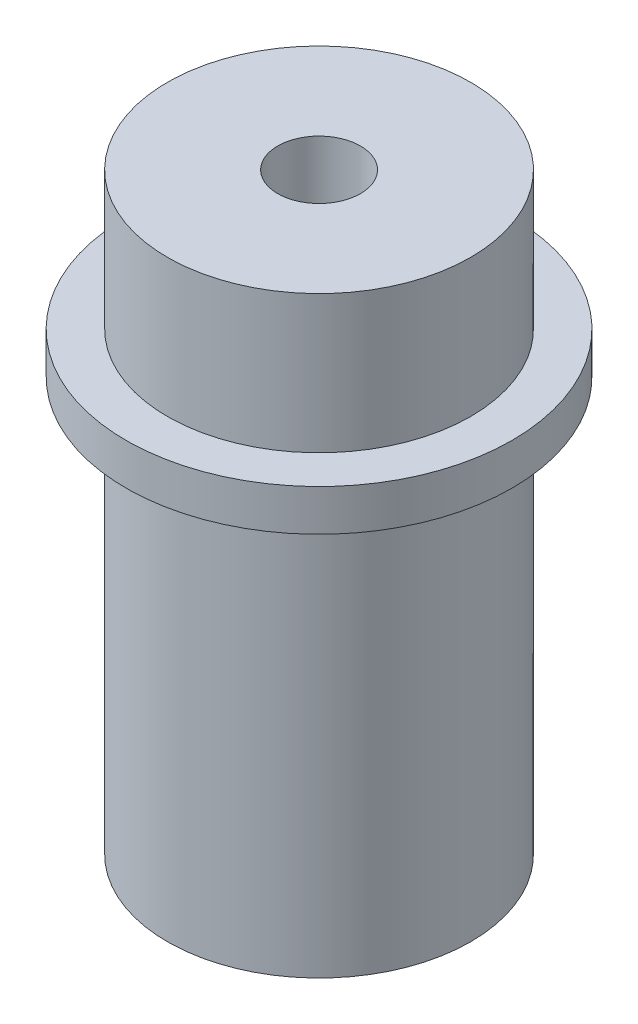
ISO-10303-21;
HEADER;
FILE_DESCRIPTION(('STEP AP214'),'2;1');
FILE_NAME('part.step','',(''),(''),'','','');
FILE_SCHEMA(('AUTOMOTIVE_DESIGN { 1 0 10303 214 1 1 1 1 }'));
ENDSEC;
DATA;
#1=APPLICATION_CONTEXT('core data for automotive mechanical design processes');
#2=APPLICATION_PROTOCOL_DEFINITION('international standard','automotive_design',2000,#1);
#3=PRODUCT_CONTEXT('',#1,'mechanical');
#4=PRODUCT('Part','Part','',(#3));
#5=PRODUCT_RELATED_PRODUCT_CATEGORY('part','',(#4));
#6=PRODUCT_DEFINITION_FORMATION('','',#4);
#7=PRODUCT_DEFINITION_CONTEXT('part definition',#1,'design');
#8=PRODUCT_DEFINITION('design','',#6,#7);
#9=PRODUCT_DEFINITION_SHAPE('','',#8);
#10=(LENGTH_UNIT() NAMED_UNIT(*) SI_UNIT(.MILLI.,.METRE.));
#11=(NAMED_UNIT(*) PLANE_ANGLE_UNIT() SI_UNIT($,.RADIAN.));
#12=(NAMED_UNIT(*) SI_UNIT($,.STERADIAN.) SOLID_ANGLE_UNIT());
#13=UNCERTAINTY_MEASURE_WITH_UNIT(LENGTH_MEASURE(1.E-05),#10,'distance_accuracy_value','');
#14=(GEOMETRIC_REPRESENTATION_CONTEXT(3) GLOBAL_UNCERTAINTY_ASSIGNED_CONTEXT((#13)) GLOBAL_UNIT_ASSIGNED_CONTEXT((#10,
#11,#12)) REPRESENTATION_CONTEXT('',''));
#15=CARTESIAN_POINT('',(0.,0.,0.));
#16=DIRECTION('',(0.,0.,1.));
#17=DIRECTION('',(1.,0.,0.));
#18=AXIS2_PLACEMENT_3D('',#15,#16,#17);
#19=CARTESIAN_POINT('',(0.,0.,0.));
#20=DIRECTION('',(0.,-1.,0.));
#21=DIRECTION('',(1.,0.,0.));
#22=AXIS2_PLACEMENT_3D('',#19,#20,#21);
#23=CYLINDRICAL_SURFACE('',#22,3.);
#24=CARTESIAN_POINT('',(0.,0.,0.));
#25=DIRECTION('',(0.,-1.,0.));
#26=DIRECTION('',(1.,0.,0.));
#27=AXIS2_PLACEMENT_3D('',#24,#25,#26);
#28=CIRCLE('',#27,3.);
#29=CARTESIAN_POINT('',(3.,0.,0.));
#30=VERTEX_POINT('',#29);
#31=EDGE_CURVE('E63',#30,#30,#28,.T.);
#32=ORIENTED_EDGE('',*,*,#31,.T.);
#33=EDGE_LOOP('',(#32));
#34=FACE_BOUND('',#33,.T.);
#35=CARTESIAN_POINT('',(0.,43.,0.));
#36=DIRECTION('',(0.,-1.,0.));
#37=DIRECTION('',(1.,0.,0.));
#38=AXIS2_PLACEMENT_3D('',#35,#36,#37);
#39=CIRCLE('',#38,3.);
#40=CARTESIAN_POINT('',(3.,43.,0.));
#41=VERTEX_POINT('',#40);
#42=EDGE_CURVE('E10',#41,#41,#39,.T.);
#43=ORIENTED_EDGE('',*,*,#42,.F.);
#44=EDGE_LOOP('',(#43));
#45=FACE_BOUND('',#44,.T.);
#46=ADVANCED_FACE('F35',(#34,#45),#23,.F.);
#47=CARTESIAN_POINT('',(0.,43.,0.));
#48=DIRECTION('',(0.,-1.,0.));
#49=DIRECTION('',(1.,0.,0.));
#50=AXIS2_PLACEMENT_3D('',#47,#48,#49);
#51=PLANE('',#50);
#52=CARTESIAN_POINT('',(0.,43.,0.));
#53=DIRECTION('',(0.,-1.,0.));
#54=DIRECTION('',(1.,0.,0.));
#55=AXIS2_PLACEMENT_3D('',#52,#53,#54);
#56=CIRCLE('',#55,11.);
#57=CARTESIAN_POINT('',(11.,43.,0.));
#58=VERTEX_POINT('',#57);
#59=EDGE_CURVE('E41',#58,#58,#56,.T.);
#60=ORIENTED_EDGE('',*,*,#59,.F.);
#61=EDGE_LOOP('',(#60));
#62=FACE_BOUND('',#61,.T.);
#63=ORIENTED_EDGE('',*,*,#42,.T.);
#64=EDGE_LOOP('',(#63));
#65=FACE_BOUND('',#64,.T.);
#66=ADVANCED_FACE('F81',(#62,#65),#51,.F.);
#67=CARTESIAN_POINT('',(0.,0.,0.));
#68=DIRECTION('',(0.,-1.,0.));
#69=DIRECTION('',(1.,0.,0.));
#70=AXIS2_PLACEMENT_3D('',#67,#68,#69);
#71=CYLINDRICAL_SURFACE('',#70,11.);
#72=ORIENTED_EDGE('',*,*,#59,.T.);
#73=EDGE_LOOP('',(#72));
#74=FACE_BOUND('',#73,.T.);
#75=CARTESIAN_POINT('',(0.,33.,0.));
#76=DIRECTION('',(0.,-1.,0.));
#77=DIRECTION('',(1.,0.,0.));
#78=AXIS2_PLACEMENT_3D('',#75,#76,#77);
#79=CIRCLE('',#78,11.);
#80=CARTESIAN_POINT('',(11.,33.,0.));
#81=VERTEX_POINT('',#80);
#82=EDGE_CURVE('E45',#81,#81,#79,.T.);
#83=ORIENTED_EDGE('',*,*,#82,.F.);
#84=EDGE_LOOP('',(#83));
#85=FACE_BOUND('',#84,.T.);
#86=ADVANCED_FACE('F85',(#74,#85),#71,.T.);
#87=CARTESIAN_POINT('',(0.,33.,0.));
#88=DIRECTION('',(0.,-1.,0.));
#89=DIRECTION('',(1.,0.,0.));
#90=AXIS2_PLACEMENT_3D('',#87,#88,#89);
#91=PLANE('',#90);
#92=CARTESIAN_POINT('',(0.,33.,0.));
#93=DIRECTION('',(0.,-1.,0.));
#94=DIRECTION('',(1.,0.,0.));
#95=AXIS2_PLACEMENT_3D('',#92,#93,#94);
#96=CIRCLE('',#95,14.);
#97=CARTESIAN_POINT('',(14.,33.,0.));
#98=VERTEX_POINT('',#97);
#99=EDGE_CURVE('E49',#98,#98,#96,.T.);
#100=ORIENTED_EDGE('',*,*,#99,.F.);
#101=EDGE_LOOP('',(#100));
#102=FACE_BOUND('',#101,.T.);
#103=ORIENTED_EDGE('',*,*,#82,.T.);
#104=EDGE_LOOP('',(#103));
#105=FACE_BOUND('',#104,.T.);
#106=ADVANCED_FACE('F90',(#102,#105),#91,.F.);
#107=CARTESIAN_POINT('',(0.,0.,0.));
#108=DIRECTION('',(0.,-1.,0.));
#109=DIRECTION('',(1.,0.,0.));
#110=AXIS2_PLACEMENT_3D('',#107,#108,#109);
#111=CYLINDRICAL_SURFACE('',#110,14.);
#112=ORIENTED_EDGE('',*,*,#99,.T.);
#113=EDGE_LOOP('',(#112));
#114=FACE_BOUND('',#113,.T.);
#115=CARTESIAN_POINT('',(0.,30.,0.));
#116=DIRECTION('',(0.,-1.,0.));
#117=DIRECTION('',(1.,0.,0.));
#118=AXIS2_PLACEMENT_3D('',#115,#116,#117);
#119=CIRCLE('',#118,14.);
#120=CARTESIAN_POINT('',(14.,30.,0.));
#121=VERTEX_POINT('',#120);
#122=EDGE_CURVE('E54',#121,#121,#119,.T.);
#123=ORIENTED_EDGE('',*,*,#122,.F.);
#124=EDGE_LOOP('',(#123));
#125=FACE_BOUND('',#124,.T.);
#126=ADVANCED_FACE('F95',(#114,#125),#111,.T.);
#127=CARTESIAN_POINT('',(0.,30.,0.));
#128=DIRECTION('',(0.,-1.,0.));
#129=DIRECTION('',(1.,0.,0.));
#130=AXIS2_PLACEMENT_3D('',#127,#128,#129);
#131=PLANE('',#130);
#132=ORIENTED_EDGE('',*,*,#122,.T.);
#133=EDGE_LOOP('',(#132));
#134=FACE_BOUND('',#133,.T.);
#135=CARTESIAN_POINT('',(0.,30.,0.));
#136=DIRECTION('',(0.,-1.,0.));
#137=DIRECTION('',(1.,0.,0.));
#138=AXIS2_PLACEMENT_3D('',#135,#136,#137);
#139=CIRCLE('',#138,11.);
#140=CARTESIAN_POINT('',(11.,30.,0.));
#141=VERTEX_POINT('',#140);
#142=EDGE_CURVE('E57',#141,#141,#139,.T.);
#143=ORIENTED_EDGE('',*,*,#142,.F.);
#144=EDGE_LOOP('',(#143));
#145=FACE_BOUND('',#144,.T.);
#146=ADVANCED_FACE('F77',(#134,#145),#131,.T.);
#147=CARTESIAN_POINT('',(0.,0.,0.));
#148=DIRECTION('',(0.,-1.,0.));
#149=DIRECTION('',(1.,0.,0.));
#150=AXIS2_PLACEMENT_3D('',#147,#148,#149);
#151=CYLINDRICAL_SURFACE('',#150,11.);
#152=ORIENTED_EDGE('',*,*,#142,.T.);
#153=EDGE_LOOP('',(#152));
#154=FACE_BOUND('',#153,.T.);
#155=CARTESIAN_POINT('',(0.,0.,0.));
#156=DIRECTION('',(0.,-1.,0.));
#157=DIRECTION('',(1.,0.,0.));
#158=AXIS2_PLACEMENT_3D('',#155,#156,#157);
#159=CIRCLE('',#158,11.);
#160=CARTESIAN_POINT('',(11.,0.,0.));
#161=VERTEX_POINT('',#160);
#162=EDGE_CURVE('E60',#161,#161,#159,.T.);
#163=ORIENTED_EDGE('',*,*,#162,.F.);
#164=EDGE_LOOP('',(#163));
#165=FACE_BOUND('',#164,.T.);
#166=ADVANCED_FACE('F71',(#154,#165),#151,.T.);
#167=CARTESIAN_POINT('',(0.,0.,0.));
#168=DIRECTION('',(0.,-1.,0.));
#169=DIRECTION('',(1.,0.,0.));
#170=AXIS2_PLACEMENT_3D('',#167,#168,#169);
#171=PLANE('',#170);
#172=ORIENTED_EDGE('',*,*,#162,.T.);
#173=EDGE_LOOP('',(#172));
#174=FACE_BOUND('',#173,.T.);
#175=ORIENTED_EDGE('',*,*,#31,.F.);
#176=EDGE_LOOP('',(#175));
#177=FACE_BOUND('',#176,.T.);
#178=ADVANCED_FACE('F69',(#174,#177),#171,.T.);
#179=CLOSED_SHELL('',(#46,#66,#86,#106,#126,#146,#166,#178));
#180=MANIFOLD_SOLID_BREP('B2',#179);
#181=ADVANCED_BREP_SHAPE_REPRESENTATION('',(#18,#180),#14);
#182=SHAPE_DEFINITION_REPRESENTATION(#9,#181);
ENDSEC;
END-ISO-10303-21;
